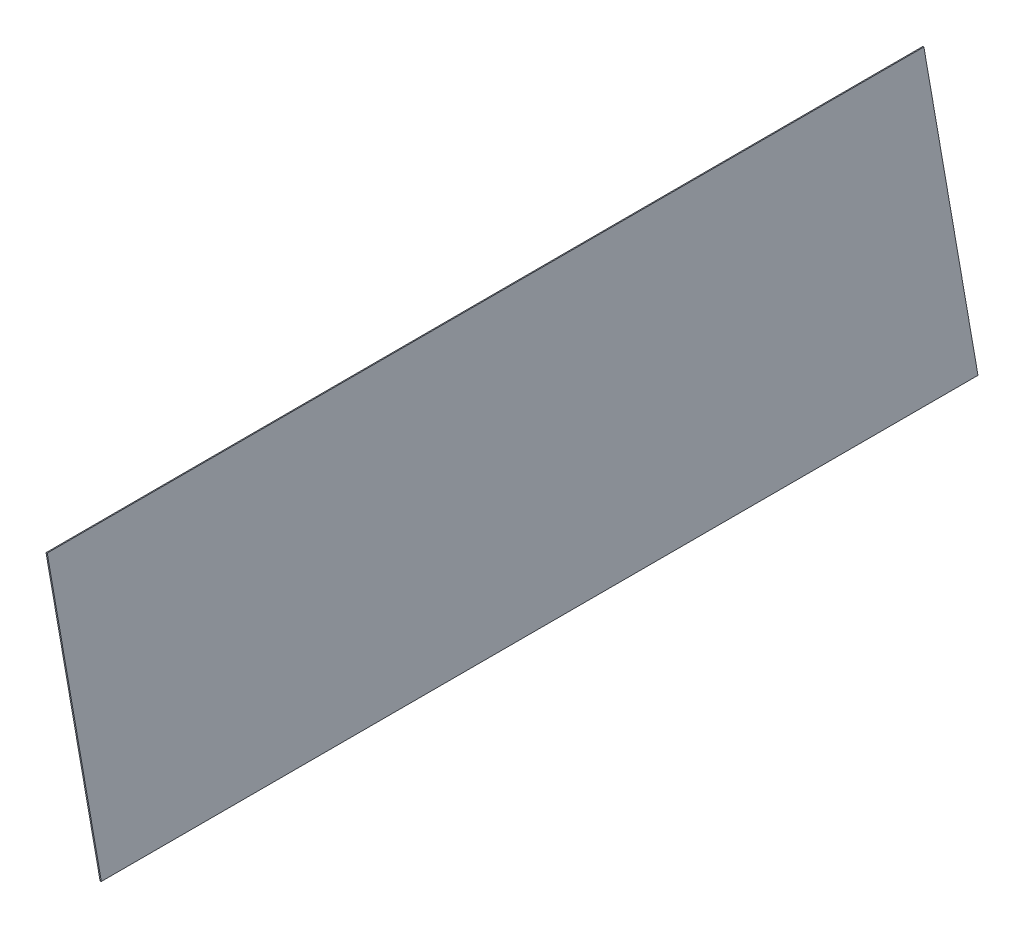
ISO-10303-21;
HEADER;
FILE_DESCRIPTION(('STEP AP214'),'2;1');
FILE_NAME('part.step','',(''),(''),'','','');
FILE_SCHEMA(('AUTOMOTIVE_DESIGN { 1 0 10303 214 1 1 1 1 }'));
ENDSEC;
DATA;
#1=APPLICATION_CONTEXT('core data for automotive mechanical design processes');
#2=APPLICATION_PROTOCOL_DEFINITION('international standard','automotive_design',2000,#1);
#3=PRODUCT_CONTEXT('',#1,'mechanical');
#4=PRODUCT('Part','Part','',(#3));
#5=PRODUCT_RELATED_PRODUCT_CATEGORY('part','',(#4));
#6=PRODUCT_DEFINITION_FORMATION('','',#4);
#7=PRODUCT_DEFINITION_CONTEXT('part definition',#1,'design');
#8=PRODUCT_DEFINITION('design','',#6,#7);
#9=PRODUCT_DEFINITION_SHAPE('','',#8);
#10=(LENGTH_UNIT() NAMED_UNIT(*) SI_UNIT(.MILLI.,.METRE.));
#11=(NAMED_UNIT(*) PLANE_ANGLE_UNIT() SI_UNIT($,.RADIAN.));
#12=(NAMED_UNIT(*) SI_UNIT($,.STERADIAN.) SOLID_ANGLE_UNIT());
#13=UNCERTAINTY_MEASURE_WITH_UNIT(LENGTH_MEASURE(1.E-05),#10,'distance_accuracy_value','');
#14=(GEOMETRIC_REPRESENTATION_CONTEXT(3) GLOBAL_UNCERTAINTY_ASSIGNED_CONTEXT((#13)) GLOBAL_UNIT_ASSIGNED_CONTEXT((#10,
#11,#12)) REPRESENTATION_CONTEXT('',''));
#15=CARTESIAN_POINT('',(0.,0.,0.));
#16=DIRECTION('',(0.,0.,1.));
#17=DIRECTION('',(1.,0.,0.));
#18=AXIS2_PLACEMENT_3D('',#15,#16,#17);
#19=CARTESIAN_POINT('',(44.54206453124,2.647150954415,38.58));
#20=DIRECTION('',(0.978598276565702,0.205780011426372,0.));
#21=DIRECTION('',(0.,0.,-1.));
#22=AXIS2_PLACEMENT_3D('',#19,#20,#21);
#23=PLANE('',#22);
#24=DIRECTION('',(0.,0.,1.));
#25=VECTOR('',#24,1.);
#26=CARTESIAN_POINT('',(44.5173699420892,2.76458744506244,31.3));
#27=LINE('',#26,#25);
#28=CARTESIAN_POINT('',(44.5173699420861,2.76458744506257,24.3));
#29=VERTEX_POINT('',#28);
#30=CARTESIAN_POINT('',(44.5173699420871,2.76458744506257,38.3));
#31=VERTEX_POINT('',#30);
#32=EDGE_CURVE('E21',#29,#31,#27,.T.);
#33=ORIENTED_EDGE('',*,*,#32,.F.);
#34=DIRECTION('',(0.20578001142641,-0.978598276565694,0.));
#35=VECTOR('',#34,1.);
#36=CARTESIAN_POINT('',(44.0852319180893,4.81964382585042,24.3));
#37=LINE('',#36,#35);
#38=CARTESIAN_POINT('',(43.6530938940932,6.87470020663761,24.3));
#39=VERTEX_POINT('',#38);
#40=EDGE_CURVE('E59',#39,#29,#37,.T.);
#41=ORIENTED_EDGE('',*,*,#40,.F.);
#42=DIRECTION('',(0.,0.,-1.));
#43=VECTOR('',#42,1.);
#44=CARTESIAN_POINT('',(43.6530938940894,6.87470020663744,31.3));
#45=LINE('',#44,#43);
#46=CARTESIAN_POINT('',(43.6530938940932,6.87470020663761,38.3));
#47=VERTEX_POINT('',#46);
#48=EDGE_CURVE('E54',#47,#39,#45,.T.);
#49=ORIENTED_EDGE('',*,*,#48,.F.);
#50=DIRECTION('',(-0.20578001142641,0.978598276565694,0.));
#51=VECTOR('',#50,1.);
#52=CARTESIAN_POINT('',(44.0852319180893,4.81964382585042,38.3));
#53=LINE('',#52,#51);
#54=EDGE_CURVE('E69',#31,#47,#53,.T.);
#55=ORIENTED_EDGE('',*,*,#54,.F.);
#56=EDGE_LOOP('',(#33,#41,#49,#55));
#57=FACE_BOUND('',#56,.T.);
#58=ADVANCED_FACE('F17',(#57),#23,.T.);
#59=CARTESIAN_POINT('',(44.49740653724,2.76038953283,38.58));
#60=DIRECTION('',(0.205780011323712,-0.978598276587289,0.));
#61=DIRECTION('',(0.,0.,-1.));
#62=AXIS2_PLACEMENT_3D('',#59,#60,#61);
#63=PLANE('',#62);
#64=DIRECTION('',(0.,0.,-1.));
#65=VECTOR('',#64,1.);
#66=CARTESIAN_POINT('',(44.497797976555,2.76047184483448,31.3));
#67=LINE('',#66,#65);
#68=CARTESIAN_POINT('',(44.497797976553,2.76047184483441,38.3));
#69=VERTEX_POINT('',#68);
#70=CARTESIAN_POINT('',(44.497797976553,2.76047184483441,24.3));
#71=VERTEX_POINT('',#70);
#72=EDGE_CURVE('E75',#69,#71,#67,.T.);
#73=ORIENTED_EDGE('',*,*,#72,.T.);
#74=DIRECTION('',(-0.978598276557802,-0.205780011463941,0.));
#75=VECTOR('',#74,1.);
#76=CARTESIAN_POINT('',(44.5075839593201,2.76252964494848,24.3));
#77=LINE('',#76,#75);
#78=EDGE_CURVE('E64',#29,#71,#77,.T.);
#79=ORIENTED_EDGE('',*,*,#78,.F.);
#80=ORIENTED_EDGE('',*,*,#32,.T.);
#81=DIRECTION('',(0.978598276557806,0.205780011463922,0.));
#82=VECTOR('',#81,1.);
#83=CARTESIAN_POINT('',(44.5075839593201,2.76252964494848,38.3));
#84=LINE('',#83,#82);
#85=EDGE_CURVE('E80',#69,#31,#84,.T.);
#86=ORIENTED_EDGE('',*,*,#85,.F.);
#87=EDGE_LOOP('',(#73,#79,#80,#86));
#88=FACE_BOUND('',#87,.T.);
#89=ADVANCED_FACE('F74',(#88),#63,.T.);
#90=CARTESIAN_POINT('',(44.5221011264,2.642953042182,24.3));
#91=DIRECTION('',(0.,0.,-1.));
#92=DIRECTION('',(-0.205780011428524,0.978598276565249,0.));
#93=AXIS2_PLACEMENT_3D('',#90,#91,#92);
#94=PLANE('',#93);
#95=ORIENTED_EDGE('',*,*,#40,.T.);
#96=ORIENTED_EDGE('',*,*,#78,.T.);
#97=DIRECTION('',(-0.205780011428526,0.978598276565249,0.));
#98=VECTOR('',#97,1.);
#99=CARTESIAN_POINT('',(44.065659952555,4.815528225622,24.3));
#100=LINE('',#99,#98);
#101=CARTESIAN_POINT('',(43.6335219285568,6.87058460640932,24.3));
#102=VERTEX_POINT('',#101);
#103=EDGE_CURVE('E85',#71,#102,#100,.T.);
#104=ORIENTED_EDGE('',*,*,#103,.T.);
#105=DIRECTION('',(-0.97859827656697,-0.205780011420343,0.));
#106=VECTOR('',#105,1.);
#107=CARTESIAN_POINT('',(43.643307911325,6.8726424065235,24.3));
#108=LINE('',#107,#106);
#109=EDGE_CURVE('E66',#39,#102,#108,.T.);
#110=ORIENTED_EDGE('',*,*,#109,.F.);
#111=EDGE_LOOP('',(#95,#96,#104,#110));
#112=FACE_BOUND('',#111,.T.);
#113=ADVANCED_FACE('F61',(#112),#94,.T.);
#114=CARTESIAN_POINT('',(43.63313048925,6.870502294405,24.02));
#115=DIRECTION('',(-0.205780011420343,0.97859827656697,0.));
#116=DIRECTION('',(0.,0.,1.));
#117=AXIS2_PLACEMENT_3D('',#114,#115,#116);
#118=PLANE('',#117);
#119=ORIENTED_EDGE('',*,*,#48,.T.);
#120=ORIENTED_EDGE('',*,*,#109,.T.);
#121=DIRECTION('',(0.,0.,1.));
#122=VECTOR('',#121,1.);
#123=CARTESIAN_POINT('',(43.633521928555,6.87058460640952,31.3));
#124=LINE('',#123,#122);
#125=CARTESIAN_POINT('',(43.633521928558,6.87058460640943,38.3));
#126=VERTEX_POINT('',#125);
#127=EDGE_CURVE('E27',#102,#126,#124,.T.);
#128=ORIENTED_EDGE('',*,*,#127,.T.);
#129=DIRECTION('',(-0.978598276577051,-0.205780011372404,0.));
#130=VECTOR('',#129,1.);
#131=CARTESIAN_POINT('',(43.6433079113249,6.87264240652352,38.3));
#132=LINE('',#131,#130);
#133=EDGE_CURVE('E35',#47,#126,#132,.T.);
#134=ORIENTED_EDGE('',*,*,#133,.F.);
#135=EDGE_LOOP('',(#119,#120,#128,#134));
#136=FACE_BOUND('',#135,.T.);
#137=ADVANCED_FACE('F89',(#136),#118,.T.);
#138=CARTESIAN_POINT('',(43.60843590009,6.987938785052,38.3));
#139=DIRECTION('',(0.,0.,1.));
#140=DIRECTION('',(0.205780011428524,-0.978598276565249,0.));
#141=AXIS2_PLACEMENT_3D('',#138,#139,#140);
#142=PLANE('',#141);
#143=ORIENTED_EDGE('',*,*,#54,.T.);
#144=ORIENTED_EDGE('',*,*,#133,.T.);
#145=DIRECTION('',(0.205780011428524,-0.978598276565249,0.));
#146=VECTOR('',#145,1.);
#147=CARTESIAN_POINT('',(44.065659952555,4.815528225622,38.3));
#148=LINE('',#147,#146);
#149=EDGE_CURVE('E11',#126,#69,#148,.T.);
#150=ORIENTED_EDGE('',*,*,#149,.T.);
#151=ORIENTED_EDGE('',*,*,#85,.T.);
#152=EDGE_LOOP('',(#143,#144,#150,#151));
#153=FACE_BOUND('',#152,.T.);
#154=ADVANCED_FACE('F91',(#153),#142,.T.);
#155=CARTESIAN_POINT('',(44.52249256571,2.643035354187,38.58));
#156=DIRECTION('',(0.978598276565249,0.205780011428526,0.));
#157=DIRECTION('',(0.,0.,-1.));
#158=AXIS2_PLACEMENT_3D('',#155,#156,#157);
#159=PLANE('',#158);
#160=ORIENTED_EDGE('',*,*,#127,.F.);
#161=ORIENTED_EDGE('',*,*,#103,.F.);
#162=ORIENTED_EDGE('',*,*,#72,.F.);
#163=ORIENTED_EDGE('',*,*,#149,.F.);
#164=EDGE_LOOP('',(#160,#161,#162,#163));
#165=FACE_BOUND('',#164,.T.);
#166=ADVANCED_FACE('F19',(#165),#159,.F.);
#167=CLOSED_SHELL('',(#58,#89,#113,#137,#154,#166));
#168=MANIFOLD_SOLID_BREP('B1',#167);
#169=ADVANCED_BREP_SHAPE_REPRESENTATION('',(#18,#168),#14);
#170=SHAPE_DEFINITION_REPRESENTATION(#9,#169);
ENDSEC;
END-ISO-10303-21;
